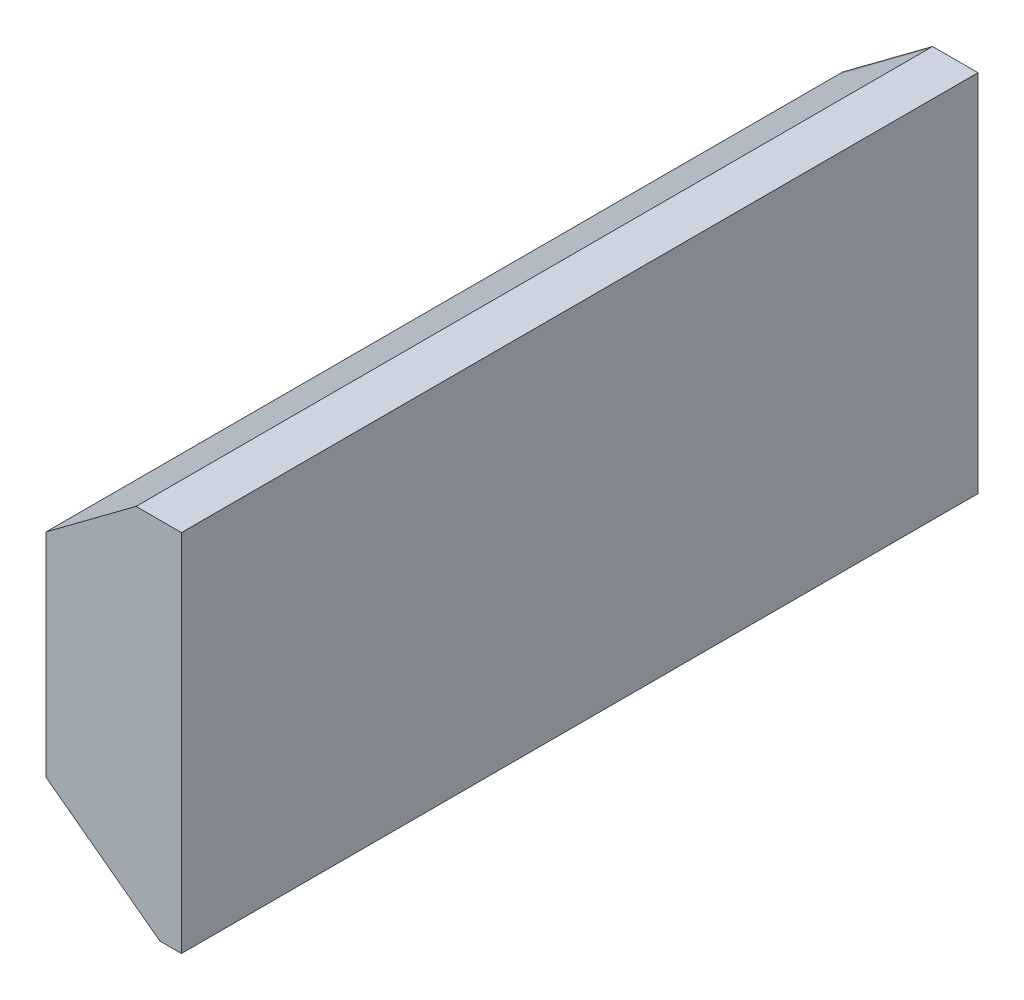
ISO-10303-21;
HEADER;
FILE_DESCRIPTION(('STEP AP214'),'2;1');
FILE_NAME('part.step','',(''),(''),'','','');
FILE_SCHEMA(('AUTOMOTIVE_DESIGN { 1 0 10303 214 1 1 1 1 }'));
ENDSEC;
DATA;
#1=APPLICATION_CONTEXT('core data for automotive mechanical design processes');
#2=APPLICATION_PROTOCOL_DEFINITION('international standard','automotive_design',2000,#1);
#3=PRODUCT_CONTEXT('',#1,'mechanical');
#4=PRODUCT('Part','Part','',(#3));
#5=PRODUCT_RELATED_PRODUCT_CATEGORY('part','',(#4));
#6=PRODUCT_DEFINITION_FORMATION('','',#4);
#7=PRODUCT_DEFINITION_CONTEXT('part definition',#1,'design');
#8=PRODUCT_DEFINITION('design','',#6,#7);
#9=PRODUCT_DEFINITION_SHAPE('','',#8);
#10=(LENGTH_UNIT() NAMED_UNIT(*) SI_UNIT(.MILLI.,.METRE.));
#11=(NAMED_UNIT(*) PLANE_ANGLE_UNIT() SI_UNIT($,.RADIAN.));
#12=(NAMED_UNIT(*) SI_UNIT($,.STERADIAN.) SOLID_ANGLE_UNIT());
#13=UNCERTAINTY_MEASURE_WITH_UNIT(LENGTH_MEASURE(1.E-05),#10,'distance_accuracy_value','');
#14=(GEOMETRIC_REPRESENTATION_CONTEXT(3) GLOBAL_UNCERTAINTY_ASSIGNED_CONTEXT((#13)) GLOBAL_UNIT_ASSIGNED_CONTEXT((#10,
#11,#12)) REPRESENTATION_CONTEXT('',''));
#15=CARTESIAN_POINT('',(0.,0.,0.));
#16=DIRECTION('',(0.,0.,1.));
#17=DIRECTION('',(1.,0.,0.));
#18=AXIS2_PLACEMENT_3D('',#15,#16,#17);
#19=CARTESIAN_POINT('',(0.,0.,-150.));
#20=DIRECTION('',(0.,0.,1.));
#21=DIRECTION('',(1.,0.,0.));
#22=AXIS2_PLACEMENT_3D('',#19,#20,#21);
#23=PLANE('',#22);
#24=DIRECTION('',(1.,0.,0.));
#25=VECTOR('',#24,1.);
#26=CARTESIAN_POINT('',(-308.554799780113,77.7625120885841,-150.));
#27=LINE('',#26,#25);
#28=CARTESIAN_POINT('',(-308.553136985618,77.7625120885841,-150.));
#29=VERTEX_POINT('',#28);
#30=CARTESIAN_POINT('',(-300.,77.7625120885841,-149.999999999977));
#31=VERTEX_POINT('',#30);
#32=EDGE_CURVE('E140',#29,#31,#27,.T.);
#33=ORIENTED_EDGE('',*,*,#32,.T.);
#34=DIRECTION('',(0.,-1.,0.));
#35=VECTOR('',#34,1.);
#36=CARTESIAN_POINT('',(-300.,0.,-150.));
#37=LINE('',#36,#35);
#38=CARTESIAN_POINT('',(-300.,9.11891061329306,-149.999999999977));
#39=VERTEX_POINT('',#38);
#40=EDGE_CURVE('E40',#31,#39,#37,.T.);
#41=ORIENTED_EDGE('',*,*,#40,.T.);
#42=DIRECTION('',(-1.,0.,0.));
#43=VECTOR('',#42,1.);
#44=CARTESIAN_POINT('',(-304.054799780113,9.11891061329305,-150.));
#45=LINE('',#44,#43);
#46=CARTESIAN_POINT('',(-304.052956885192,9.11891061329305,-150.));
#47=VERTEX_POINT('',#46);
#48=EDGE_CURVE('E45',#39,#47,#45,.T.);
#49=ORIENTED_EDGE('',*,*,#48,.T.);
#50=CARTESIAN_POINT('',(-304.052956885192,9.11891061329304,-150.));
#51=CARTESIAN_POINT('',(-307.628340446863,11.7855528822422,-150.));
#52=CARTESIAN_POINT('',(-311.203712055111,14.4522111779688,-150.));
#53=CARTESIAN_POINT('',(-316.566757961196,18.4522140488977,-150.));
#54=CARTESIAN_POINT('',(-318.354438012211,19.785550910457,-150.));
#55=CARTESIAN_POINT('',(-321.929795349428,22.4522283405305,-150.));
#56=CARTESIAN_POINT('',(-323.717472635628,23.7855689090447,-150.));
#57=CARTESIAN_POINT('',(-325.505149074732,25.118910613293,-150.));
#58=B_SPLINE_CURVE_WITH_KNOTS('',3,(#50,#51,#52,#53,#54,#55,#56,#57),.UNSPECIFIED.,.F.,.F.,(4,2,
2,4),(0.,13.3809243861647,20.0713865795136,26.7618487728941),.UNSPECIFIED.);
#59=CARTESIAN_POINT('',(-325.505149074732,25.118910613293,-150.));
#60=VERTEX_POINT('',#59);
#61=EDGE_CURVE('E111',#47,#60,#58,.T.);
#62=ORIENTED_EDGE('',*,*,#61,.T.);
#63=DIRECTION('',(0.,1.,0.));
#64=VECTOR('',#63,1.);
#65=CARTESIAN_POINT('',(-325.505149074732,45.118910613293,-150.));
#66=LINE('',#65,#64);
#67=CARTESIAN_POINT('',(-325.505149074732,65.1189106132931,-150.));
#68=VERTEX_POINT('',#67);
#69=EDGE_CURVE('E174',#60,#68,#66,.T.);
#70=ORIENTED_EDGE('',*,*,#69,.T.);
#71=CARTESIAN_POINT('',(-325.505149074732,65.1189106132931,-150.));
#72=CARTESIAN_POINT('',(-324.092484946622,66.1725488238386,-150.));
#73=CARTESIAN_POINT('',(-322.67982023086,67.226186246493,-150.));
#74=CARTESIAN_POINT('',(-319.85448917577,69.3334589150016,-150.));
#75=CARTESIAN_POINT('',(-318.441822836442,70.3870941608558,-150.));
#76=CARTESIAN_POINT('',(-314.203820710675,73.5479957317227,-150.));
#77=CARTESIAN_POINT('',(-311.378481816496,75.6552578900079,-150.));
#78=CARTESIAN_POINT('',(-308.553136985618,77.7625120885841,-150.));
#79=B_SPLINE_CURVE_WITH_KNOTS('',3,(#71,#72,#73,#74,#75,#76,#77,#78),.UNSPECIFIED.,.F.,.F.,(4,2,
2,4),(0.,5.28696139177814,10.5739227835569,21.1478455672744),.UNSPECIFIED.);
#80=EDGE_CURVE('E169',#68,#29,#79,.T.);
#81=ORIENTED_EDGE('',*,*,#80,.T.);
#82=EDGE_LOOP('',(#33,#41,#49,#62,#70,#81));
#83=FACE_BOUND('',#82,.T.);
#84=ADVANCED_FACE('F36',(#83),#23,.F.);
#85=CARTESIAN_POINT('',(-308.554799780113,77.7625120885841,-149.499973367811));
#86=DIRECTION('',(0.,1.,0.));
#87=DIRECTION('',(-1.,0.,0.));
#88=AXIS2_PLACEMENT_3D('',#85,#86,#87);
#89=PLANE('',#88);
#90=CARTESIAN_POINT('',(-262.506364446809,77.7625120885841,-208.339640738144));
#91=CARTESIAN_POINT('',(-289.480913338998,77.7625120885841,-208.339640738144));
#92=CARTESIAN_POINT('',(-308.554799780113,77.7625120885841,-183.96745250783));
#93=CARTESIAN_POINT('',(-308.554799780113,77.7625120885841,-149.499973367811));
#94=(BOUNDED_CURVE() B_SPLINE_CURVE(3,(#90,#91,#92,#93),.UNSPECIFIED.,.F.,
.F.) B_SPLINE_CURVE_WITH_KNOTS((4,4),(0.,1.),
.UNSPECIFIED.) CURVE() GEOMETRIC_REPRESENTATION_ITEM() RATIONAL_B_SPLINE_CURVE((1.,
0.804737854124365,0.804737854124365,1.)) REPRESENTATION_ITEM(''));
#95=CARTESIAN_POINT('',(-308.554799780113,77.7625120885841,-149.499973367811));
#96=VERTEX_POINT('',#95);
#97=EDGE_CURVE('E134',#29,#96,#94,.T.);
#98=ORIENTED_EDGE('',*,*,#97,.T.);
#99=DIRECTION('',(0.,0.,1.));
#100=VECTOR('',#99,1.);
#101=CARTESIAN_POINT('',(-308.554799780113,77.7625120885841,-149.499973367811));
#102=LINE('',#101,#100);
#103=CARTESIAN_POINT('',(-308.554799780113,77.7625120885841,0.));
#104=VERTEX_POINT('',#103);
#105=EDGE_CURVE('E113',#96,#104,#102,.T.);
#106=ORIENTED_EDGE('',*,*,#105,.T.);
#107=DIRECTION('',(1.,0.,0.));
#108=VECTOR('',#107,1.);
#109=CARTESIAN_POINT('',(-308.554799780113,77.7625120885841,0.));
#110=LINE('',#109,#108);
#111=CARTESIAN_POINT('',(-300.,77.7625120885841,0.));
#112=VERTEX_POINT('',#111);
#113=EDGE_CURVE('E141',#104,#112,#110,.T.);
#114=ORIENTED_EDGE('',*,*,#113,.T.);
#115=DIRECTION('',(0.,0.,-1.));
#116=VECTOR('',#115,1.);
#117=CARTESIAN_POINT('',(-300.,77.7625120885841,-149.499973367811));
#118=LINE('',#117,#116);
#119=EDGE_CURVE('E137',#112,#31,#118,.T.);
#120=ORIENTED_EDGE('',*,*,#119,.T.);
#121=ORIENTED_EDGE('',*,*,#32,.F.);
#122=EDGE_LOOP('',(#98,#106,#114,#120,#121));
#123=FACE_BOUND('',#122,.T.);
#124=ADVANCED_FACE('F205',(#123),#89,.T.);
#125=CARTESIAN_POINT('',(-262.506364446809,25.118910613293,-68.9999733678111));
#126=CARTESIAN_POINT('',(-136.506364446809,25.118910613293,-68.9999733678111));
#127=CARTESIAN_POINT('',(-136.506364446809,25.118910613293,-229.999973367811));
#128=CARTESIAN_POINT('',(-262.506364446809,25.118910613293,-229.999973367811));
#129=CARTESIAN_POINT('',(-388.506364446809,25.118910613293,-229.999973367811));
#130=CARTESIAN_POINT('',(-388.506364446809,25.118910613293,-68.9999733678111));
#131=CARTESIAN_POINT('',(-262.506364446809,25.118910613293,-68.9999733678111));
#132=CARTESIAN_POINT('',(-262.506364446809,9.11891061329304,-96.4103059974782));
#133=CARTESIAN_POINT('',(-179.409493780201,9.11891061329304,-96.4103059974782));
#134=CARTESIAN_POINT('',(-179.409493780201,9.11891061329304,-202.589640738144));
#135=CARTESIAN_POINT('',(-262.506364446809,9.11891061329304,-202.589640738144));
#136=CARTESIAN_POINT('',(-345.603235113417,9.11891061329303,-202.589640738144));
#137=CARTESIAN_POINT('',(-345.603235113417,9.11891061329303,-96.4103059974782));
#138=CARTESIAN_POINT('',(-262.506364446809,9.11891061329304,-96.4103059974782));
#139=(BOUNDED_SURFACE() B_SPLINE_SURFACE(1,3,((#125,#126,#127,#128,#129,#130,#131),(#132,#133,
#134,#135,#136,#137,#138)),.UNSPECIFIED.,.F.,.T.,.F.) B_SPLINE_SURFACE_WITH_KNOTS((2,2),(4,3,4),
(0.,1.),(0.,0.5,1.),
.UNSPECIFIED.) GEOMETRIC_REPRESENTATION_ITEM() RATIONAL_B_SPLINE_SURFACE(((1.,0.333333333333333,
0.333333333333333,1.,0.333333333333333,0.333333333333333,1.),(1.,0.333333333333333,
0.333333333333333,1.,0.333333333333333,0.333333333333333,1.))) REPRESENTATION_ITEM('') SURFACE());
#140=CARTESIAN_POINT('',(-262.506364446809,9.11891061329306,-202.589640738144));
#141=CARTESIAN_POINT('',(-286.844874369677,9.11891061329305,-202.589640738144));
#142=CARTESIAN_POINT('',(-304.054799780113,9.11891061329305,-180.599180491476));
#143=CARTESIAN_POINT('',(-304.054799780113,9.11891061329306,-149.499973367811));
#144=(BOUNDED_CURVE() B_SPLINE_CURVE(3,(#140,#141,#142,#143),.UNSPECIFIED.,.F.,
.F.) B_SPLINE_CURVE_WITH_KNOTS((4,4),(0.,1.),
.UNSPECIFIED.) CURVE() GEOMETRIC_REPRESENTATION_ITEM() RATIONAL_B_SPLINE_CURVE((1.,
0.804737854124365,0.804737854124365,1.)) REPRESENTATION_ITEM(''));
#145=CARTESIAN_POINT('',(-304.054799780113,9.11891061329306,-149.499973367811));
#146=VERTEX_POINT('',#145);
#147=EDGE_CURVE('E104',#47,#146,#144,.T.);
#148=DIRECTION('',(0.801587665382151,-0.597877257225255,0.));
#149=VECTOR('',#148,1.);
#150=CARTESIAN_POINT('',(-304.054799780113,9.11891061329306,-149.499973367811));
#151=LINE('',#150,#149);
#152=CARTESIAN_POINT('',(-325.506364446809,25.118910613293,-149.499973367811));
#153=VERTEX_POINT('',#152);
#154=EDGE_CURVE('E109',#153,#146,#151,.T.);
#155=CARTESIAN_POINT('',(-262.506364446809,25.118910613293,-229.999973367811));
#156=CARTESIAN_POINT('',(-299.410910017304,25.118910613293,-229.999973367811));
#157=CARTESIAN_POINT('',(-325.506364446809,25.118910613293,-196.655781596777));
#158=CARTESIAN_POINT('',(-325.506364446809,25.118910613293,-149.499973367811));
#159=(BOUNDED_CURVE() B_SPLINE_CURVE(3,(#155,#156,#157,#158),.UNSPECIFIED.,.F.,
.F.) B_SPLINE_CURVE_WITH_KNOTS((4,4),(0.,1.),
.UNSPECIFIED.) CURVE() GEOMETRIC_REPRESENTATION_ITEM() RATIONAL_B_SPLINE_CURVE((1.,
0.804737854124365,0.804737854124365,1.)) REPRESENTATION_ITEM(''));
#160=EDGE_CURVE('E124',#60,#153,#159,.T.);
#161=ORIENTED_EDGE('',*,*,#147,.T.);
#162=ORIENTED_EDGE('',*,*,#154,.F.);
#163=ORIENTED_EDGE('',*,*,#160,.F.);
#164=ORIENTED_EDGE('',*,*,#61,.F.);
#165=EDGE_LOOP('',(#161,#162,#163,#164));
#166=FACE_BOUND('',#165,.T.);
#167=ADVANCED_FACE('F106',(#166),#139,.T.);
#168=CARTESIAN_POINT('',(-304.054799780113,9.11891061329306,-149.499973367811));
#169=DIRECTION('',(0.,-1.,0.));
#170=DIRECTION('',(1.,0.,0.));
#171=AXIS2_PLACEMENT_3D('',#168,#169,#170);
#172=PLANE('',#171);
#173=DIRECTION('',(0.,0.,1.));
#174=VECTOR('',#173,1.);
#175=CARTESIAN_POINT('',(-300.,9.11891061329305,-149.499973367811));
#176=LINE('',#175,#174);
#177=CARTESIAN_POINT('',(-300.,9.11891061329306,0.));
#178=VERTEX_POINT('',#177);
#179=EDGE_CURVE('E135',#39,#178,#176,.T.);
#180=ORIENTED_EDGE('',*,*,#179,.T.);
#181=DIRECTION('',(-1.,0.,0.));
#182=VECTOR('',#181,1.);
#183=CARTESIAN_POINT('',(-304.054799780113,9.11891061329305,0.));
#184=LINE('',#183,#182);
#185=CARTESIAN_POINT('',(-304.054799780113,9.11891061329305,0.));
#186=VERTEX_POINT('',#185);
#187=EDGE_CURVE('E60',#178,#186,#184,.T.);
#188=ORIENTED_EDGE('',*,*,#187,.T.);
#189=DIRECTION('',(0.,0.,1.));
#190=VECTOR('',#189,1.);
#191=CARTESIAN_POINT('',(-304.054799780113,9.11891061329306,-149.499973367811));
#192=LINE('',#191,#190);
#193=EDGE_CURVE('E116',#146,#186,#192,.T.);
#194=ORIENTED_EDGE('',*,*,#193,.F.);
#195=ORIENTED_EDGE('',*,*,#147,.F.);
#196=ORIENTED_EDGE('',*,*,#48,.F.);
#197=EDGE_LOOP('',(#180,#188,#194,#195,#196));
#198=FACE_BOUND('',#197,.T.);
#199=ADVANCED_FACE('F117',(#198),#172,.T.);
#200=CARTESIAN_POINT('',(-262.506364446809,9.11891061329304,-68.9999733678111));
#201=CARTESIAN_POINT('',(-136.506364446809,9.11891061329304,-68.9999733678111));
#202=CARTESIAN_POINT('',(-136.506364446809,9.11891061329304,-229.999973367811));
#203=CARTESIAN_POINT('',(-262.506364446809,9.11891061329304,-229.999973367811));
#204=CARTESIAN_POINT('',(-388.506364446809,9.11891061329304,-229.999973367811));
#205=CARTESIAN_POINT('',(-388.506364446809,9.11891061329304,-68.9999733678111));
#206=CARTESIAN_POINT('',(-262.506364446809,9.11891061329304,-68.9999733678111));
#207=(BOUNDED_CURVE() B_SPLINE_CURVE(3,(#200,#201,#202,#203,#204,#205,#206),.UNSPECIFIED.,.T.,
.F.) B_SPLINE_CURVE_WITH_KNOTS((4,3,4),(0.,0.5,1.),
.UNSPECIFIED.) CURVE() GEOMETRIC_REPRESENTATION_ITEM() RATIONAL_B_SPLINE_CURVE((1.,
0.333333333333333,0.333333333333333,1.,0.333333333333333,0.333333333333333,1.)) REPRESENTATION_ITEM(''));
#208=DIRECTION('',(0.,1.,0.));
#209=VECTOR('',#208,1.);
#210=SURFACE_OF_LINEAR_EXTRUSION('',#207,#209);
#211=ORIENTED_EDGE('',*,*,#160,.T.);
#212=DIRECTION('',(0.,-1.,0.));
#213=VECTOR('',#212,1.);
#214=CARTESIAN_POINT('',(-325.506364446809,25.118910613293,-149.499973367811));
#215=LINE('',#214,#213);
#216=CARTESIAN_POINT('',(-325.506364446809,65.1189106132931,-149.499973367811));
#217=VERTEX_POINT('',#216);
#218=EDGE_CURVE('E126',#217,#153,#215,.T.);
#219=ORIENTED_EDGE('',*,*,#218,.F.);
#220=CARTESIAN_POINT('',(-262.506364446809,65.1189106132931,-229.999973367811));
#221=CARTESIAN_POINT('',(-299.410910017304,65.1189106132931,-229.999973367811));
#222=CARTESIAN_POINT('',(-325.506364446809,65.1189106132931,-196.655781596777));
#223=CARTESIAN_POINT('',(-325.506364446809,65.1189106132931,-149.499973367811));
#224=(BOUNDED_CURVE() B_SPLINE_CURVE(3,(#220,#221,#222,#223),.UNSPECIFIED.,.F.,
.F.) B_SPLINE_CURVE_WITH_KNOTS((4,4),(0.,1.),
.UNSPECIFIED.) CURVE() GEOMETRIC_REPRESENTATION_ITEM() RATIONAL_B_SPLINE_CURVE((1.,
0.804737854124365,0.804737854124365,1.)) REPRESENTATION_ITEM(''));
#225=EDGE_CURVE('E130',#68,#217,#224,.T.);
#226=ORIENTED_EDGE('',*,*,#225,.F.);
#227=ORIENTED_EDGE('',*,*,#69,.F.);
#228=EDGE_LOOP('',(#211,#219,#226,#227));
#229=FACE_BOUND('',#228,.T.);
#230=ADVANCED_FACE('F192',(#229),#210,.T.);
#231=CARTESIAN_POINT('',(-304.054799780113,9.11891061329306,-149.499973367811));
#232=DIRECTION('',(-0.597877257225255,-0.801587665382151,0.));
#233=DIRECTION('',(0.801587665382151,-0.597877257225255,0.));
#234=AXIS2_PLACEMENT_3D('',#231,#232,#233);
#235=PLANE('',#234);
#236=DIRECTION('',(-0.801587665382151,0.597877257225255,0.));
#237=VECTOR('',#236,1.);
#238=CARTESIAN_POINT('',(-304.054799780113,9.11891061329305,0.));
#239=LINE('',#238,#237);
#240=CARTESIAN_POINT('',(-325.506364446809,25.118910613293,0.));
#241=VERTEX_POINT('',#240);
#242=EDGE_CURVE('E175',#186,#241,#239,.T.);
#243=ORIENTED_EDGE('',*,*,#242,.T.);
#244=DIRECTION('',(0.,0.,1.));
#245=VECTOR('',#244,1.);
#246=CARTESIAN_POINT('',(-325.506364446809,25.118910613293,-149.499973367811));
#247=LINE('',#246,#245);
#248=EDGE_CURVE('E119',#153,#241,#247,.T.);
#249=ORIENTED_EDGE('',*,*,#248,.F.);
#250=ORIENTED_EDGE('',*,*,#154,.T.);
#251=ORIENTED_EDGE('',*,*,#193,.T.);
#252=EDGE_LOOP('',(#243,#249,#250,#251));
#253=FACE_BOUND('',#252,.T.);
#254=ADVANCED_FACE('F121',(#253),#235,.T.);
#255=CARTESIAN_POINT('',(-325.506364446809,25.118910613293,-149.499973367811));
#256=DIRECTION('',(-1.,0.,0.));
#257=DIRECTION('',(0.,-1.,0.));
#258=AXIS2_PLACEMENT_3D('',#255,#256,#257);
#259=PLANE('',#258);
#260=DIRECTION('',(0.,1.,0.));
#261=VECTOR('',#260,1.);
#262=CARTESIAN_POINT('',(-325.506364446809,25.118910613293,0.));
#263=LINE('',#262,#261);
#264=CARTESIAN_POINT('',(-325.506364446809,65.1189106132931,0.));
#265=VERTEX_POINT('',#264);
#266=EDGE_CURVE('E172',#241,#265,#263,.T.);
#267=ORIENTED_EDGE('',*,*,#266,.T.);
#268=DIRECTION('',(0.,0.,1.));
#269=VECTOR('',#268,1.);
#270=CARTESIAN_POINT('',(-325.506364446809,65.1189106132931,-149.499973367811));
#271=LINE('',#270,#269);
#272=EDGE_CURVE('E179',#217,#265,#271,.T.);
#273=ORIENTED_EDGE('',*,*,#272,.F.);
#274=ORIENTED_EDGE('',*,*,#218,.T.);
#275=ORIENTED_EDGE('',*,*,#248,.T.);
#276=EDGE_LOOP('',(#267,#273,#274,#275));
#277=FACE_BOUND('',#276,.T.);
#278=ADVANCED_FACE('F240',(#277),#259,.T.);
#279=CARTESIAN_POINT('',(-262.506364446809,65.1189106132931,-229.999973367811));
#280=CARTESIAN_POINT('',(-136.506364446809,65.1189106132931,-229.999973367811));
#281=CARTESIAN_POINT('',(-136.506364446809,65.1189106132931,-68.999973367811));
#282=CARTESIAN_POINT('',(-262.506364446809,65.1189106132931,-68.999973367811));
#283=CARTESIAN_POINT('',(-388.506364446809,65.1189106132931,-68.999973367811));
#284=CARTESIAN_POINT('',(-388.506364446809,65.1189106132931,-229.999973367811));
#285=CARTESIAN_POINT('',(-262.506364446809,65.1189106132931,-229.999973367811));
#286=CARTESIAN_POINT('',(-262.506364446809,77.7625120885841,-208.339640738144));
#287=CARTESIAN_POINT('',(-170.409493780201,77.7625120885842,-208.339640738144));
#288=CARTESIAN_POINT('',(-170.409493780201,77.7625120885842,-90.6603059974782));
#289=CARTESIAN_POINT('',(-262.506364446809,77.7625120885841,-90.6603059974782));
#290=CARTESIAN_POINT('',(-354.603235113417,77.7625120885841,-90.6603059974782));
#291=CARTESIAN_POINT('',(-354.603235113417,77.7625120885841,-208.339640738144));
#292=CARTESIAN_POINT('',(-262.506364446809,77.7625120885841,-208.339640738144));
#293=(BOUNDED_SURFACE() B_SPLINE_SURFACE(1,3,((#279,#280,#281,#282,#283,#284,#285),(#286,#287,
#288,#289,#290,#291,#292)),.UNSPECIFIED.,.F.,.T.,.F.) B_SPLINE_SURFACE_WITH_KNOTS((2,2),(4,3,4),
(0.,1.),(0.,0.5,1.),
.UNSPECIFIED.) GEOMETRIC_REPRESENTATION_ITEM() RATIONAL_B_SPLINE_SURFACE(((1.,0.333333333333333,
0.333333333333333,1.,0.333333333333333,0.333333333333333,1.),(1.,0.333333333333333,
0.333333333333333,1.,0.333333333333333,0.333333333333333,1.))) REPRESENTATION_ITEM('') SURFACE());
#294=DIRECTION('',(-0.801587665382147,-0.597877257225261,0.));
#295=VECTOR('',#294,1.);
#296=CARTESIAN_POINT('',(-325.506364446809,65.1189106132931,-149.499973367811));
#297=LINE('',#296,#295);
#298=EDGE_CURVE('E131',#96,#217,#297,.T.);
#299=ORIENTED_EDGE('',*,*,#225,.T.);
#300=ORIENTED_EDGE('',*,*,#298,.F.);
#301=ORIENTED_EDGE('',*,*,#97,.F.);
#302=ORIENTED_EDGE('',*,*,#80,.F.);
#303=EDGE_LOOP('',(#299,#300,#301,#302));
#304=FACE_BOUND('',#303,.T.);
#305=ADVANCED_FACE('F196',(#304),#293,.T.);
#306=CARTESIAN_POINT('',(-325.506364446809,65.1189106132931,-149.499973367811));
#307=DIRECTION('',(-0.597877257225261,0.801587665382146,0.));
#308=DIRECTION('',(-0.801587665382147,-0.597877257225261,0.));
#309=AXIS2_PLACEMENT_3D('',#306,#307,#308);
#310=PLANE('',#309);
#311=DIRECTION('',(0.801587665382147,0.597877257225261,0.));
#312=VECTOR('',#311,1.);
#313=CARTESIAN_POINT('',(-325.506364446809,65.1189106132931,0.));
#314=LINE('',#313,#312);
#315=EDGE_CURVE('E166',#265,#104,#314,.T.);
#316=ORIENTED_EDGE('',*,*,#315,.T.);
#317=ORIENTED_EDGE('',*,*,#105,.F.);
#318=ORIENTED_EDGE('',*,*,#298,.T.);
#319=ORIENTED_EDGE('',*,*,#272,.T.);
#320=EDGE_LOOP('',(#316,#317,#318,#319));
#321=FACE_BOUND('',#320,.T.);
#322=ADVANCED_FACE('F244',(#321),#310,.T.);
#323=CARTESIAN_POINT('',(0.,0.,0.));
#324=DIRECTION('',(0.,0.,1.));
#325=DIRECTION('',(1.,0.,0.));
#326=AXIS2_PLACEMENT_3D('',#323,#324,#325);
#327=PLANE('',#326);
#328=ORIENTED_EDGE('',*,*,#113,.F.);
#329=ORIENTED_EDGE('',*,*,#315,.F.);
#330=ORIENTED_EDGE('',*,*,#266,.F.);
#331=ORIENTED_EDGE('',*,*,#242,.F.);
#332=ORIENTED_EDGE('',*,*,#187,.F.);
#333=DIRECTION('',(0.,-1.,0.));
#334=VECTOR('',#333,1.);
#335=CARTESIAN_POINT('',(-300.,0.,0.));
#336=LINE('',#335,#334);
#337=EDGE_CURVE('E11',#112,#178,#336,.T.);
#338=ORIENTED_EDGE('',*,*,#337,.F.);
#339=EDGE_LOOP('',(#328,#329,#330,#331,#332,#338));
#340=FACE_BOUND('',#339,.T.);
#341=ADVANCED_FACE('F245',(#340),#327,.T.);
#342=CARTESIAN_POINT('',(-300.,0.,0.));
#343=DIRECTION('',(1.,0.,0.));
#344=DIRECTION('',(0.,0.,-1.));
#345=AXIS2_PLACEMENT_3D('',#342,#343,#344);
#346=PLANE('',#345);
#347=ORIENTED_EDGE('',*,*,#179,.F.);
#348=ORIENTED_EDGE('',*,*,#40,.F.);
#349=ORIENTED_EDGE('',*,*,#119,.F.);
#350=ORIENTED_EDGE('',*,*,#337,.T.);
#351=EDGE_LOOP('',(#347,#348,#349,#350));
#352=FACE_BOUND('',#351,.T.);
#353=ADVANCED_FACE('F38',(#352),#346,.T.);
#354=CLOSED_SHELL('',(#84,#124,#167,#199,#230,#254,#278,#305,#322,#341,#353));
#355=MANIFOLD_SOLID_BREP('B2',#354);
#356=ADVANCED_BREP_SHAPE_REPRESENTATION('',(#18,#355),#14);
#357=SHAPE_DEFINITION_REPRESENTATION(#9,#356);
ENDSEC;
END-ISO-10303-21;
